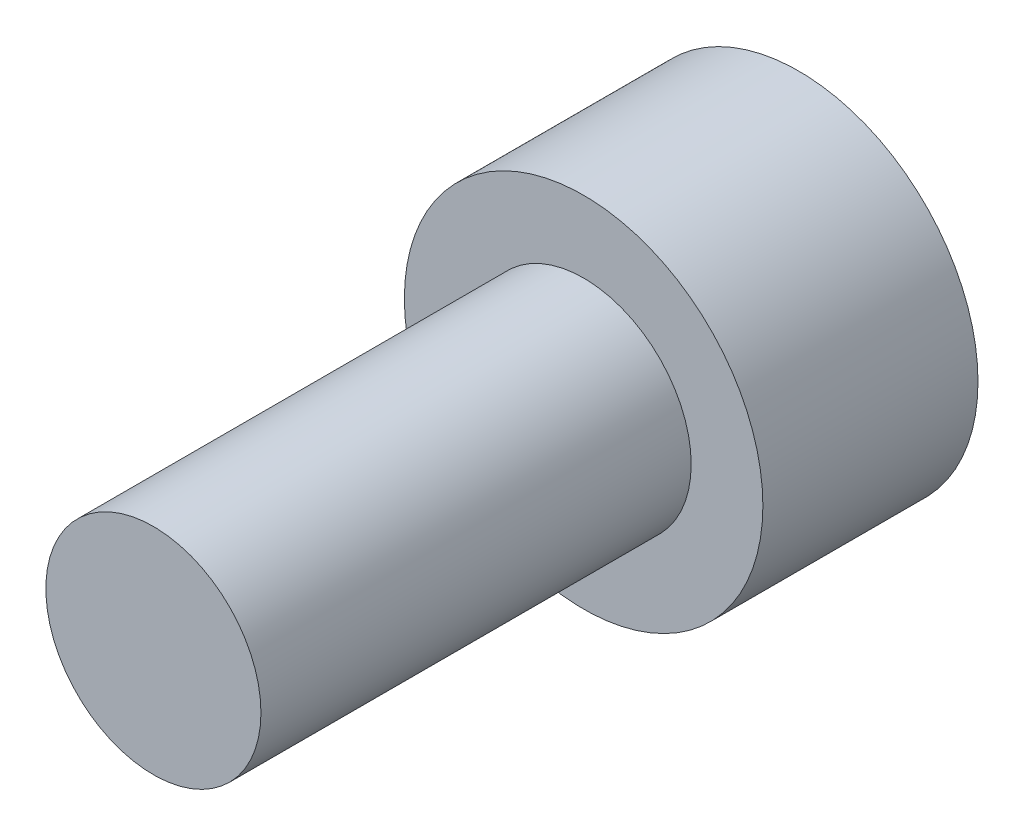
ISO-10303-21;
HEADER;
FILE_DESCRIPTION(('STEP AP214'),'2;1');
FILE_NAME('part.step','',(''),(''),'','','');
FILE_SCHEMA(('AUTOMOTIVE_DESIGN { 1 0 10303 214 1 1 1 1 }'));
ENDSEC;
DATA;
#1=APPLICATION_CONTEXT('core data for automotive mechanical design processes');
#2=APPLICATION_PROTOCOL_DEFINITION('international standard','automotive_design',2000,#1);
#3=PRODUCT_CONTEXT('',#1,'mechanical');
#4=PRODUCT('Part','Part','',(#3));
#5=PRODUCT_RELATED_PRODUCT_CATEGORY('part','',(#4));
#6=PRODUCT_DEFINITION_FORMATION('','',#4);
#7=PRODUCT_DEFINITION_CONTEXT('part definition',#1,'design');
#8=PRODUCT_DEFINITION('design','',#6,#7);
#9=PRODUCT_DEFINITION_SHAPE('','',#8);
#10=(LENGTH_UNIT() NAMED_UNIT(*) SI_UNIT(.MILLI.,.METRE.));
#11=(NAMED_UNIT(*) PLANE_ANGLE_UNIT() SI_UNIT($,.RADIAN.));
#12=(NAMED_UNIT(*) SI_UNIT($,.STERADIAN.) SOLID_ANGLE_UNIT());
#13=UNCERTAINTY_MEASURE_WITH_UNIT(LENGTH_MEASURE(1.E-05),#10,'distance_accuracy_value','');
#14=(GEOMETRIC_REPRESENTATION_CONTEXT(3) GLOBAL_UNCERTAINTY_ASSIGNED_CONTEXT((#13)) GLOBAL_UNIT_ASSIGNED_CONTEXT((#10,
#11,#12)) REPRESENTATION_CONTEXT('',''));
#15=CARTESIAN_POINT('',(0.,0.,0.));
#16=DIRECTION('',(0.,0.,1.));
#17=DIRECTION('',(1.,0.,0.));
#18=AXIS2_PLACEMENT_3D('',#15,#16,#17);
#19=CARTESIAN_POINT('',(0.,0.,-6.));
#20=DIRECTION('',(0.,0.,1.));
#21=DIRECTION('',(1.,0.,0.));
#22=AXIS2_PLACEMENT_3D('',#19,#20,#21);
#23=PLANE('',#22);
#24=CARTESIAN_POINT('',(0.,0.,-6.));
#25=DIRECTION('',(0.,0.,1.));
#26=DIRECTION('',(1.,0.,0.));
#27=AXIS2_PLACEMENT_3D('',#24,#25,#26);
#28=CIRCLE('',#27,5.);
#29=CARTESIAN_POINT('',(5.,0.,-6.));
#30=VERTEX_POINT('',#29);
#31=EDGE_CURVE('E47',#30,#30,#28,.T.);
#32=ORIENTED_EDGE('',*,*,#31,.F.);
#33=EDGE_LOOP('',(#32));
#34=FACE_BOUND('',#33,.T.);
#35=DIRECTION('',(0.5,0.866025403784439,0.));
#36=VECTOR('',#35,1.);
#37=CARTESIAN_POINT('',(1.44337567297406,-2.5,-6.));
#38=LINE('',#37,#36);
#39=CARTESIAN_POINT('',(1.44337567297406,-2.5,-6.));
#40=VERTEX_POINT('',#39);
#41=CARTESIAN_POINT('',(2.88675134594813,0.,-6.));
#42=VERTEX_POINT('',#41);
#43=EDGE_CURVE('E62',#40,#42,#38,.T.);
#44=ORIENTED_EDGE('',*,*,#43,.T.);
#45=DIRECTION('',(-0.5,0.866025403784439,0.));
#46=VECTOR('',#45,1.);
#47=CARTESIAN_POINT('',(2.88675134594813,0.,-6.));
#48=LINE('',#47,#46);
#49=CARTESIAN_POINT('',(1.44337567297406,2.5,-6.));
#50=VERTEX_POINT('',#49);
#51=EDGE_CURVE('E138',#42,#50,#48,.T.);
#52=ORIENTED_EDGE('',*,*,#51,.T.);
#53=DIRECTION('',(-1.,0.,0.));
#54=VECTOR('',#53,1.);
#55=CARTESIAN_POINT('',(1.44337567297406,2.5,-6.));
#56=LINE('',#55,#54);
#57=CARTESIAN_POINT('',(-1.44337567297406,2.5,-6.));
#58=VERTEX_POINT('',#57);
#59=EDGE_CURVE('E141',#50,#58,#56,.T.);
#60=ORIENTED_EDGE('',*,*,#59,.T.);
#61=DIRECTION('',(-0.5,-0.866025403784439,0.));
#62=VECTOR('',#61,1.);
#63=CARTESIAN_POINT('',(-1.44337567297406,2.5,-6.));
#64=LINE('',#63,#62);
#65=CARTESIAN_POINT('',(-2.88675134594813,0.,-6.));
#66=VERTEX_POINT('',#65);
#67=EDGE_CURVE('E150',#58,#66,#64,.T.);
#68=ORIENTED_EDGE('',*,*,#67,.T.);
#69=DIRECTION('',(0.5,-0.866025403784439,0.));
#70=VECTOR('',#69,1.);
#71=CARTESIAN_POINT('',(-2.88675134594813,0.,-6.));
#72=LINE('',#71,#70);
#73=CARTESIAN_POINT('',(-1.44337567297407,-2.5,-6.));
#74=VERTEX_POINT('',#73);
#75=EDGE_CURVE('E125',#66,#74,#72,.T.);
#76=ORIENTED_EDGE('',*,*,#75,.T.);
#77=DIRECTION('',(1.,0.,0.));
#78=VECTOR('',#77,1.);
#79=CARTESIAN_POINT('',(-1.44337567297407,-2.5,-6.));
#80=LINE('',#79,#78);
#81=EDGE_CURVE('E155',#74,#40,#80,.T.);
#82=ORIENTED_EDGE('',*,*,#81,.T.);
#83=EDGE_LOOP('',(#44,#52,#60,#68,#76,#82));
#84=FACE_BOUND('',#83,.T.);
#85=ADVANCED_FACE('F44',(#34,#84),#23,.F.);
#86=CARTESIAN_POINT('',(0.,0.,0.));
#87=DIRECTION('',(0.,0.,-1.));
#88=DIRECTION('',(-1.,0.,0.));
#89=AXIS2_PLACEMENT_3D('',#86,#87,#88);
#90=CYLINDRICAL_SURFACE('',#89,5.);
#91=CARTESIAN_POINT('',(0.,0.,0.));
#92=DIRECTION('',(0.,0.,1.));
#93=DIRECTION('',(1.,0.,0.));
#94=AXIS2_PLACEMENT_3D('',#91,#92,#93);
#95=CIRCLE('',#94,5.);
#96=CARTESIAN_POINT('',(5.,0.,0.));
#97=VERTEX_POINT('',#96);
#98=EDGE_CURVE('E54',#97,#97,#95,.T.);
#99=ORIENTED_EDGE('',*,*,#98,.F.);
#100=EDGE_LOOP('',(#99));
#101=FACE_BOUND('',#100,.T.);
#102=ORIENTED_EDGE('',*,*,#31,.T.);
#103=EDGE_LOOP('',(#102));
#104=FACE_BOUND('',#103,.T.);
#105=ADVANCED_FACE('F50',(#101,#104),#90,.T.);
#106=CARTESIAN_POINT('',(0.,0.,0.));
#107=DIRECTION('',(0.,0.,1.));
#108=DIRECTION('',(1.,0.,0.));
#109=AXIS2_PLACEMENT_3D('',#106,#107,#108);
#110=PLANE('',#109);
#111=CARTESIAN_POINT('',(0.,0.,0.));
#112=DIRECTION('',(0.,0.,1.));
#113=DIRECTION('',(1.,0.,0.));
#114=AXIS2_PLACEMENT_3D('',#111,#112,#113);
#115=CIRCLE('',#114,3.);
#116=CARTESIAN_POINT('',(3.,0.,0.));
#117=VERTEX_POINT('',#116);
#118=EDGE_CURVE('E11',#117,#117,#115,.T.);
#119=ORIENTED_EDGE('',*,*,#118,.F.);
#120=EDGE_LOOP('',(#119));
#121=FACE_BOUND('',#120,.T.);
#122=ORIENTED_EDGE('',*,*,#98,.T.);
#123=EDGE_LOOP('',(#122));
#124=FACE_BOUND('',#123,.T.);
#125=ADVANCED_FACE('F212',(#121,#124),#110,.T.);
#126=CARTESIAN_POINT('',(0.,0.,12.));
#127=DIRECTION('',(0.,0.,-1.));
#128=DIRECTION('',(-1.,0.,0.));
#129=AXIS2_PLACEMENT_3D('',#126,#127,#128);
#130=CYLINDRICAL_SURFACE('',#129,3.);
#131=CARTESIAN_POINT('',(0.,0.,12.));
#132=DIRECTION('',(0.,0.,1.));
#133=DIRECTION('',(1.,0.,0.));
#134=AXIS2_PLACEMENT_3D('',#131,#132,#133);
#135=CIRCLE('',#134,3.);
#136=CARTESIAN_POINT('',(3.,0.,12.));
#137=VERTEX_POINT('',#136);
#138=EDGE_CURVE('E166',#137,#137,#135,.T.);
#139=ORIENTED_EDGE('',*,*,#138,.F.);
#140=EDGE_LOOP('',(#139));
#141=FACE_BOUND('',#140,.T.);
#142=ORIENTED_EDGE('',*,*,#118,.T.);
#143=EDGE_LOOP('',(#142));
#144=FACE_BOUND('',#143,.T.);
#145=ADVANCED_FACE('F209',(#141,#144),#130,.T.);
#146=CARTESIAN_POINT('',(0.,0.,12.));
#147=DIRECTION('',(0.,0.,1.));
#148=DIRECTION('',(1.,0.,0.));
#149=AXIS2_PLACEMENT_3D('',#146,#147,#148);
#150=PLANE('',#149);
#151=ORIENTED_EDGE('',*,*,#138,.T.);
#152=EDGE_LOOP('',(#151));
#153=FACE_BOUND('',#152,.T.);
#154=ADVANCED_FACE('F204',(#153),#150,.T.);
#155=CARTESIAN_POINT('',(1.44337567297406,-2.5,-3.));
#156=DIRECTION('',(-0.866025403784439,0.5,0.));
#157=DIRECTION('',(-0.5,-0.866025403784439,0.));
#158=AXIS2_PLACEMENT_3D('',#155,#156,#157);
#159=PLANE('',#158);
#160=ORIENTED_EDGE('',*,*,#43,.F.);
#161=DIRECTION('',(0.,0.,-1.));
#162=VECTOR('',#161,1.);
#163=CARTESIAN_POINT('',(1.44337567297406,-2.5,-3.));
#164=LINE('',#163,#162);
#165=CARTESIAN_POINT('',(1.44337567297406,-2.5,-3.));
#166=VERTEX_POINT('',#165);
#167=EDGE_CURVE('E132',#166,#40,#164,.T.);
#168=ORIENTED_EDGE('',*,*,#167,.F.);
#169=DIRECTION('',(0.5,0.866025403784439,0.));
#170=VECTOR('',#169,1.);
#171=CARTESIAN_POINT('',(1.44337567297406,-2.5,-3.));
#172=LINE('',#171,#170);
#173=CARTESIAN_POINT('',(2.88675134594813,0.,-3.));
#174=VERTEX_POINT('',#173);
#175=EDGE_CURVE('E156',#166,#174,#172,.T.);
#176=ORIENTED_EDGE('',*,*,#175,.T.);
#177=DIRECTION('',(0.,0.,-1.));
#178=VECTOR('',#177,1.);
#179=CARTESIAN_POINT('',(2.88675134594813,0.,-3.));
#180=LINE('',#179,#178);
#181=EDGE_CURVE('E167',#174,#42,#180,.T.);
#182=ORIENTED_EDGE('',*,*,#181,.T.);
#183=EDGE_LOOP('',(#160,#168,#176,#182));
#184=FACE_BOUND('',#183,.T.);
#185=ADVANCED_FACE('F184',(#184),#159,.T.);
#186=CARTESIAN_POINT('',(2.88675134594813,0.,-3.));
#187=DIRECTION('',(-0.866025403784439,-0.5,0.));
#188=DIRECTION('',(0.5,-0.866025403784439,0.));
#189=AXIS2_PLACEMENT_3D('',#186,#187,#188);
#190=PLANE('',#189);
#191=ORIENTED_EDGE('',*,*,#51,.F.);
#192=ORIENTED_EDGE('',*,*,#181,.F.);
#193=DIRECTION('',(-0.5,0.866025403784439,0.));
#194=VECTOR('',#193,1.);
#195=CARTESIAN_POINT('',(2.88675134594813,0.,-3.));
#196=LINE('',#195,#194);
#197=CARTESIAN_POINT('',(1.44337567297406,2.5,-3.));
#198=VERTEX_POINT('',#197);
#199=EDGE_CURVE('E105',#174,#198,#196,.T.);
#200=ORIENTED_EDGE('',*,*,#199,.T.);
#201=DIRECTION('',(0.,0.,-1.));
#202=VECTOR('',#201,1.);
#203=CARTESIAN_POINT('',(1.44337567297406,2.5,-3.));
#204=LINE('',#203,#202);
#205=EDGE_CURVE('E162',#198,#50,#204,.T.);
#206=ORIENTED_EDGE('',*,*,#205,.T.);
#207=EDGE_LOOP('',(#191,#192,#200,#206));
#208=FACE_BOUND('',#207,.T.);
#209=ADVANCED_FACE('F198',(#208),#190,.T.);
#210=CARTESIAN_POINT('',(1.44337567297406,2.5,-3.));
#211=DIRECTION('',(0.,-1.,0.));
#212=DIRECTION('',(1.,0.,0.));
#213=AXIS2_PLACEMENT_3D('',#210,#211,#212);
#214=PLANE('',#213);
#215=ORIENTED_EDGE('',*,*,#59,.F.);
#216=ORIENTED_EDGE('',*,*,#205,.F.);
#217=DIRECTION('',(-1.,0.,0.));
#218=VECTOR('',#217,1.);
#219=CARTESIAN_POINT('',(1.44337567297406,2.5,-3.));
#220=LINE('',#219,#218);
#221=CARTESIAN_POINT('',(-1.44337567297406,2.5,-3.));
#222=VERTEX_POINT('',#221);
#223=EDGE_CURVE('E121',#198,#222,#220,.T.);
#224=ORIENTED_EDGE('',*,*,#223,.T.);
#225=DIRECTION('',(0.,0.,-1.));
#226=VECTOR('',#225,1.);
#227=CARTESIAN_POINT('',(-1.44337567297406,2.5,-3.));
#228=LINE('',#227,#226);
#229=EDGE_CURVE('E119',#222,#58,#228,.T.);
#230=ORIENTED_EDGE('',*,*,#229,.T.);
#231=EDGE_LOOP('',(#215,#216,#224,#230));
#232=FACE_BOUND('',#231,.T.);
#233=ADVANCED_FACE('F193',(#232),#214,.T.);
#234=CARTESIAN_POINT('',(-1.44337567297406,2.5,-3.));
#235=DIRECTION('',(0.866025403784438,-0.5,0.));
#236=DIRECTION('',(0.5,0.866025403784439,0.));
#237=AXIS2_PLACEMENT_3D('',#234,#235,#236);
#238=PLANE('',#237);
#239=ORIENTED_EDGE('',*,*,#67,.F.);
#240=ORIENTED_EDGE('',*,*,#229,.F.);
#241=DIRECTION('',(-0.5,-0.866025403784439,0.));
#242=VECTOR('',#241,1.);
#243=CARTESIAN_POINT('',(-1.44337567297406,2.5,-3.));
#244=LINE('',#243,#242);
#245=CARTESIAN_POINT('',(-2.88675134594813,0.,-3.));
#246=VERTEX_POINT('',#245);
#247=EDGE_CURVE('E115',#222,#246,#244,.T.);
#248=ORIENTED_EDGE('',*,*,#247,.T.);
#249=DIRECTION('',(0.,0.,-1.));
#250=VECTOR('',#249,1.);
#251=CARTESIAN_POINT('',(-2.88675134594813,0.,-3.));
#252=LINE('',#251,#250);
#253=EDGE_CURVE('E118',#246,#66,#252,.T.);
#254=ORIENTED_EDGE('',*,*,#253,.T.);
#255=EDGE_LOOP('',(#239,#240,#248,#254));
#256=FACE_BOUND('',#255,.T.);
#257=ADVANCED_FACE('F113',(#256),#238,.T.);
#258=CARTESIAN_POINT('',(-2.88675134594813,0.,-3.));
#259=DIRECTION('',(0.866025403784439,0.5,0.));
#260=DIRECTION('',(-0.5,0.866025403784439,0.));
#261=AXIS2_PLACEMENT_3D('',#258,#259,#260);
#262=PLANE('',#261);
#263=ORIENTED_EDGE('',*,*,#75,.F.);
#264=ORIENTED_EDGE('',*,*,#253,.F.);
#265=DIRECTION('',(0.5,-0.866025403784439,0.));
#266=VECTOR('',#265,1.);
#267=CARTESIAN_POINT('',(-2.88675134594813,0.,-3.));
#268=LINE('',#267,#266);
#269=CARTESIAN_POINT('',(-1.44337567297407,-2.5,-3.));
#270=VERTEX_POINT('',#269);
#271=EDGE_CURVE('E116',#246,#270,#268,.T.);
#272=ORIENTED_EDGE('',*,*,#271,.T.);
#273=DIRECTION('',(0.,0.,-1.));
#274=VECTOR('',#273,1.);
#275=CARTESIAN_POINT('',(-1.44337567297407,-2.5,-3.));
#276=LINE('',#275,#274);
#277=EDGE_CURVE('E91',#270,#74,#276,.T.);
#278=ORIENTED_EDGE('',*,*,#277,.T.);
#279=EDGE_LOOP('',(#263,#264,#272,#278));
#280=FACE_BOUND('',#279,.T.);
#281=ADVANCED_FACE('F124',(#280),#262,.T.);
#282=CARTESIAN_POINT('',(-1.44337567297407,-2.5,-3.));
#283=DIRECTION('',(0.,1.,0.));
#284=DIRECTION('',(-1.,0.,0.));
#285=AXIS2_PLACEMENT_3D('',#282,#283,#284);
#286=PLANE('',#285);
#287=ORIENTED_EDGE('',*,*,#81,.F.);
#288=ORIENTED_EDGE('',*,*,#277,.F.);
#289=DIRECTION('',(1.,0.,0.));
#290=VECTOR('',#289,1.);
#291=CARTESIAN_POINT('',(-1.44337567297407,-2.5,-3.));
#292=LINE('',#291,#290);
#293=EDGE_CURVE('E72',#270,#166,#292,.T.);
#294=ORIENTED_EDGE('',*,*,#293,.T.);
#295=ORIENTED_EDGE('',*,*,#167,.T.);
#296=EDGE_LOOP('',(#287,#288,#294,#295));
#297=FACE_BOUND('',#296,.T.);
#298=ADVANCED_FACE('F181',(#297),#286,.T.);
#299=CARTESIAN_POINT('',(0.,0.,-3.));
#300=DIRECTION('',(0.,0.,1.));
#301=DIRECTION('',(1.,0.,0.));
#302=AXIS2_PLACEMENT_3D('',#299,#300,#301);
#303=PLANE('',#302);
#304=ORIENTED_EDGE('',*,*,#175,.F.);
#305=ORIENTED_EDGE('',*,*,#293,.F.);
#306=ORIENTED_EDGE('',*,*,#271,.F.);
#307=ORIENTED_EDGE('',*,*,#247,.F.);
#308=ORIENTED_EDGE('',*,*,#223,.F.);
#309=ORIENTED_EDGE('',*,*,#199,.F.);
#310=EDGE_LOOP('',(#304,#305,#306,#307,#308,#309));
#311=FACE_BOUND('',#310,.T.);
#312=ADVANCED_FACE('F129',(#311),#303,.F.);
#313=CLOSED_SHELL('',(#85,#105,#125,#145,#154,#185,#209,#233,#257,#281,#298,#312));
#314=MANIFOLD_SOLID_BREP('B2',#313);
#315=ADVANCED_BREP_SHAPE_REPRESENTATION('',(#18,#314),#14);
#316=SHAPE_DEFINITION_REPRESENTATION(#9,#315);
ENDSEC;
END-ISO-10303-21;
